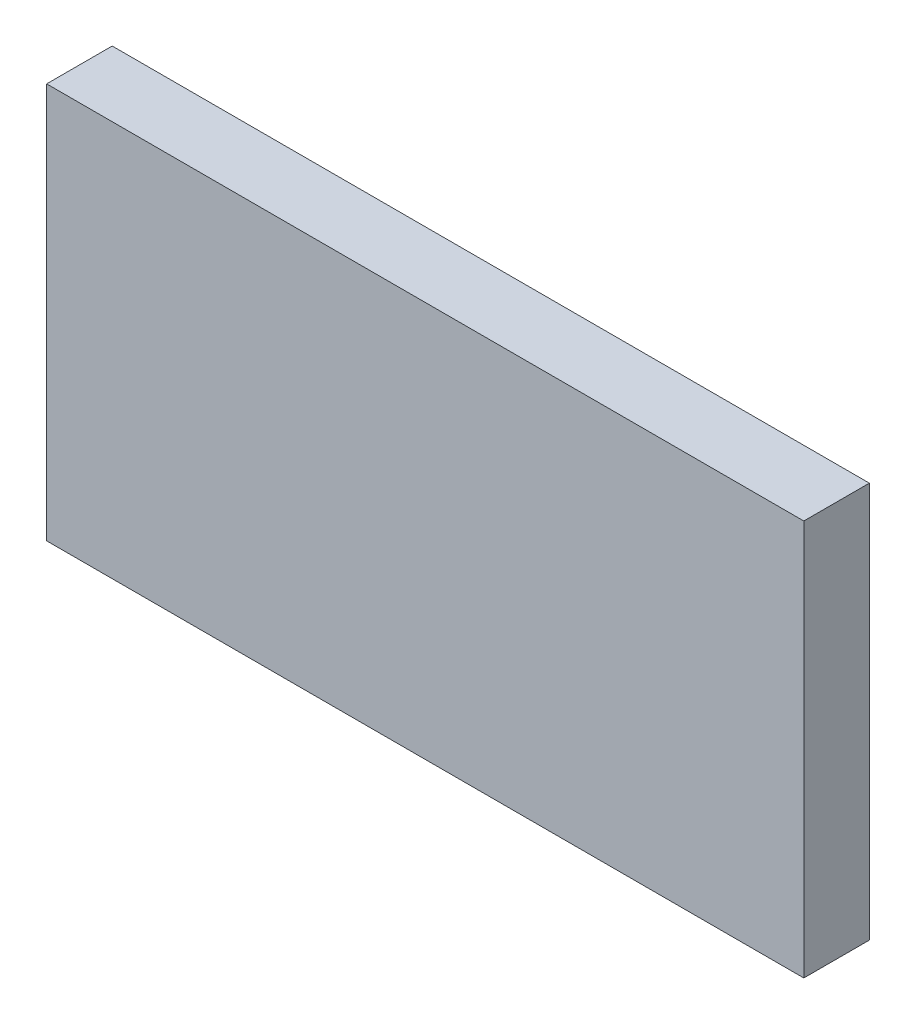
ISO-10303-21;
HEADER;
FILE_DESCRIPTION(('STEP AP214'),'2;1');
FILE_NAME('part.step','',(''),(''),'','','');
FILE_SCHEMA(('AUTOMOTIVE_DESIGN { 1 0 10303 214 1 1 1 1 }'));
ENDSEC;
DATA;
#1=APPLICATION_CONTEXT('core data for automotive mechanical design processes');
#2=APPLICATION_PROTOCOL_DEFINITION('international standard','automotive_design',2000,#1);
#3=PRODUCT_CONTEXT('',#1,'mechanical');
#4=PRODUCT('Part','Part','',(#3));
#5=PRODUCT_RELATED_PRODUCT_CATEGORY('part','',(#4));
#6=PRODUCT_DEFINITION_FORMATION('','',#4);
#7=PRODUCT_DEFINITION_CONTEXT('part definition',#1,'design');
#8=PRODUCT_DEFINITION('design','',#6,#7);
#9=PRODUCT_DEFINITION_SHAPE('','',#8);
#10=(LENGTH_UNIT() NAMED_UNIT(*) SI_UNIT(.MILLI.,.METRE.));
#11=(NAMED_UNIT(*) PLANE_ANGLE_UNIT() SI_UNIT($,.RADIAN.));
#12=(NAMED_UNIT(*) SI_UNIT($,.STERADIAN.) SOLID_ANGLE_UNIT());
#13=UNCERTAINTY_MEASURE_WITH_UNIT(LENGTH_MEASURE(1.E-05),#10,'distance_accuracy_value','');
#14=(GEOMETRIC_REPRESENTATION_CONTEXT(3) GLOBAL_UNCERTAINTY_ASSIGNED_CONTEXT((#13)) GLOBAL_UNIT_ASSIGNED_CONTEXT((#10,
#11,#12)) REPRESENTATION_CONTEXT('',''));
#15=CARTESIAN_POINT('',(0.,0.,0.));
#16=DIRECTION('',(0.,0.,1.));
#17=DIRECTION('',(1.,0.,0.));
#18=AXIS2_PLACEMENT_3D('',#15,#16,#17);
#19=CARTESIAN_POINT('',(4.4,2.3,0.762001524003));
#20=DIRECTION('',(0.,0.,1.));
#21=DIRECTION('',(-1.,0.,0.));
#22=AXIS2_PLACEMENT_3D('',#19,#20,#21);
#23=PLANE('',#22);
#24=DIRECTION('',(0.,1.,0.));
#25=VECTOR('',#24,1.);
#26=CARTESIAN_POINT('',(-4.4,0.,0.762001524003));
#27=LINE('',#26,#25);
#28=CARTESIAN_POINT('',(-4.4,-2.3,0.762001524003));
#29=VERTEX_POINT('',#28);
#30=CARTESIAN_POINT('',(-4.4,2.3,0.762001524003));
#31=VERTEX_POINT('',#30);
#32=EDGE_CURVE('E77',#29,#31,#27,.T.);
#33=ORIENTED_EDGE('',*,*,#32,.F.);
#34=DIRECTION('',(-1.,0.,0.));
#35=VECTOR('',#34,1.);
#36=CARTESIAN_POINT('',(0.,-2.3,0.762001524003));
#37=LINE('',#36,#35);
#38=CARTESIAN_POINT('',(4.4,-2.3,0.762001524003));
#39=VERTEX_POINT('',#38);
#40=EDGE_CURVE('E59',#39,#29,#37,.T.);
#41=ORIENTED_EDGE('',*,*,#40,.F.);
#42=DIRECTION('',(0.,1.,0.));
#43=VECTOR('',#42,1.);
#44=CARTESIAN_POINT('',(4.4,0.,0.762001524003));
#45=LINE('',#44,#43);
#46=CARTESIAN_POINT('',(4.4,2.3,0.762001524003));
#47=VERTEX_POINT('',#46);
#48=EDGE_CURVE('E21',#39,#47,#45,.T.);
#49=ORIENTED_EDGE('',*,*,#48,.T.);
#50=DIRECTION('',(-1.,0.,0.));
#51=VECTOR('',#50,1.);
#52=CARTESIAN_POINT('',(0.,2.3,0.762001524003));
#53=LINE('',#52,#51);
#54=EDGE_CURVE('E56',#47,#31,#53,.T.);
#55=ORIENTED_EDGE('',*,*,#54,.T.);
#56=EDGE_LOOP('',(#33,#41,#49,#55));
#57=FACE_BOUND('',#56,.T.);
#58=ADVANCED_FACE('F17',(#57),#23,.T.);
#59=CARTESIAN_POINT('',(4.4,-2.3,0.));
#60=DIRECTION('',(-1.,0.,0.));
#61=DIRECTION('',(0.,0.,1.));
#62=AXIS2_PLACEMENT_3D('',#59,#60,#61);
#63=PLANE('',#62);
#64=DIRECTION('',(0.,0.,1.));
#65=VECTOR('',#64,1.);
#66=CARTESIAN_POINT('',(4.4,-2.3,0.3810007620015));
#67=LINE('',#66,#65);
#68=CARTESIAN_POINT('',(4.4,-2.3,0.));
#69=VERTEX_POINT('',#68);
#70=EDGE_CURVE('E79',#69,#39,#67,.T.);
#71=ORIENTED_EDGE('',*,*,#70,.F.);
#72=DIRECTION('',(0.,1.,0.));
#73=VECTOR('',#72,1.);
#74=CARTESIAN_POINT('',(4.4,0.,0.));
#75=LINE('',#74,#73);
#76=CARTESIAN_POINT('',(4.4,2.3,0.));
#77=VERTEX_POINT('',#76);
#78=EDGE_CURVE('E74',#69,#77,#75,.T.);
#79=ORIENTED_EDGE('',*,*,#78,.T.);
#80=DIRECTION('',(0.,0.,1.));
#81=VECTOR('',#80,1.);
#82=CARTESIAN_POINT('',(4.4,2.3,0.3810007620015));
#83=LINE('',#82,#81);
#84=EDGE_CURVE('E64',#77,#47,#83,.T.);
#85=ORIENTED_EDGE('',*,*,#84,.T.);
#86=ORIENTED_EDGE('',*,*,#48,.F.);
#87=EDGE_LOOP('',(#71,#79,#85,#86));
#88=FACE_BOUND('',#87,.T.);
#89=ADVANCED_FACE('F73',(#88),#63,.F.);
#90=CARTESIAN_POINT('',(4.4,2.3,0.));
#91=DIRECTION('',(0.,-1.,0.));
#92=DIRECTION('',(0.,0.,1.));
#93=AXIS2_PLACEMENT_3D('',#90,#91,#92);
#94=PLANE('',#93);
#95=ORIENTED_EDGE('',*,*,#54,.F.);
#96=ORIENTED_EDGE('',*,*,#84,.F.);
#97=DIRECTION('',(-1.,0.,0.));
#98=VECTOR('',#97,1.);
#99=CARTESIAN_POINT('',(0.,2.3,0.));
#100=LINE('',#99,#98);
#101=CARTESIAN_POINT('',(-4.4,2.3,0.));
#102=VERTEX_POINT('',#101);
#103=EDGE_CURVE('E84',#77,#102,#100,.T.);
#104=ORIENTED_EDGE('',*,*,#103,.T.);
#105=DIRECTION('',(0.,0.,-1.));
#106=VECTOR('',#105,1.);
#107=CARTESIAN_POINT('',(-4.4,2.3,0.3810007620015));
#108=LINE('',#107,#106);
#109=EDGE_CURVE('E70',#31,#102,#108,.T.);
#110=ORIENTED_EDGE('',*,*,#109,.F.);
#111=EDGE_LOOP('',(#95,#96,#104,#110));
#112=FACE_BOUND('',#111,.T.);
#113=ADVANCED_FACE('F67',(#112),#94,.F.);
#114=CARTESIAN_POINT('',(-4.4,-2.3,0.));
#115=DIRECTION('',(-1.,0.,0.));
#116=DIRECTION('',(0.,0.,1.));
#117=AXIS2_PLACEMENT_3D('',#114,#115,#116);
#118=PLANE('',#117);
#119=DIRECTION('',(0.,0.,-1.));
#120=VECTOR('',#119,1.);
#121=CARTESIAN_POINT('',(-4.4,-2.3,0.3810007620015));
#122=LINE('',#121,#120);
#123=CARTESIAN_POINT('',(-4.4,-2.3,0.));
#124=VERTEX_POINT('',#123);
#125=EDGE_CURVE('E35',#29,#124,#122,.T.);
#126=ORIENTED_EDGE('',*,*,#125,.F.);
#127=ORIENTED_EDGE('',*,*,#32,.T.);
#128=ORIENTED_EDGE('',*,*,#109,.T.);
#129=DIRECTION('',(0.,-1.,0.));
#130=VECTOR('',#129,1.);
#131=CARTESIAN_POINT('',(-4.4,0.,0.));
#132=LINE('',#131,#130);
#133=EDGE_CURVE('E27',#102,#124,#132,.T.);
#134=ORIENTED_EDGE('',*,*,#133,.T.);
#135=EDGE_LOOP('',(#126,#127,#128,#134));
#136=FACE_BOUND('',#135,.T.);
#137=ADVANCED_FACE('F89',(#136),#118,.T.);
#138=CARTESIAN_POINT('',(4.4,-2.3,0.));
#139=DIRECTION('',(0.,-1.,0.));
#140=DIRECTION('',(0.,0.,1.));
#141=AXIS2_PLACEMENT_3D('',#138,#139,#140);
#142=PLANE('',#141);
#143=ORIENTED_EDGE('',*,*,#40,.T.);
#144=ORIENTED_EDGE('',*,*,#125,.T.);
#145=DIRECTION('',(1.,0.,0.));
#146=VECTOR('',#145,1.);
#147=CARTESIAN_POINT('',(0.,-2.3,0.));
#148=LINE('',#147,#146);
#149=EDGE_CURVE('E11',#124,#69,#148,.T.);
#150=ORIENTED_EDGE('',*,*,#149,.T.);
#151=ORIENTED_EDGE('',*,*,#70,.T.);
#152=EDGE_LOOP('',(#143,#144,#150,#151));
#153=FACE_BOUND('',#152,.T.);
#154=ADVANCED_FACE('F91',(#153),#142,.T.);
#155=CARTESIAN_POINT('',(4.4,2.3,0.));
#156=DIRECTION('',(0.,0.,1.));
#157=DIRECTION('',(-1.,0.,0.));
#158=AXIS2_PLACEMENT_3D('',#155,#156,#157);
#159=PLANE('',#158);
#160=ORIENTED_EDGE('',*,*,#133,.F.);
#161=ORIENTED_EDGE('',*,*,#103,.F.);
#162=ORIENTED_EDGE('',*,*,#78,.F.);
#163=ORIENTED_EDGE('',*,*,#149,.F.);
#164=EDGE_LOOP('',(#160,#161,#162,#163));
#165=FACE_BOUND('',#164,.T.);
#166=ADVANCED_FACE('F19',(#165),#159,.F.);
#167=CLOSED_SHELL('',(#58,#89,#113,#137,#154,#166));
#168=MANIFOLD_SOLID_BREP('B1',#167);
#169=ADVANCED_BREP_SHAPE_REPRESENTATION('',(#18,#168),#14);
#170=SHAPE_DEFINITION_REPRESENTATION(#9,#169);
ENDSEC;
END-ISO-10303-21;
